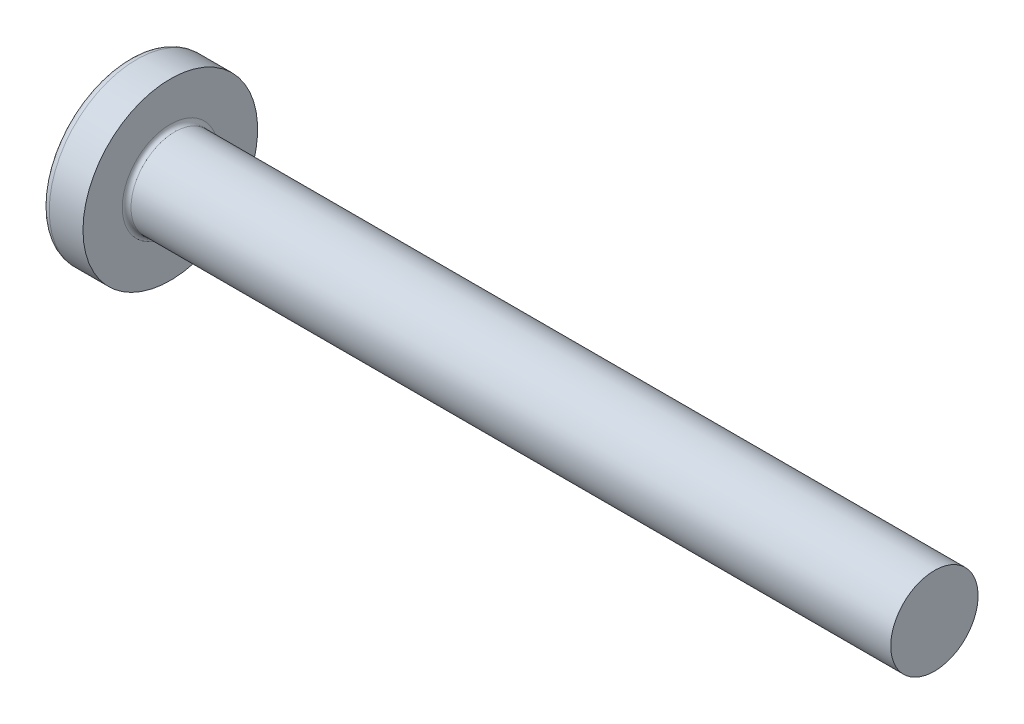
ISO-10303-21;
HEADER;
FILE_DESCRIPTION(('STEP AP214'),'2;1');
FILE_NAME('part.step','',(''),(''),'','','');
FILE_SCHEMA(('AUTOMOTIVE_DESIGN { 1 0 10303 214 1 1 1 1 }'));
ENDSEC;
DATA;
#1=APPLICATION_CONTEXT('core data for automotive mechanical design processes');
#2=APPLICATION_PROTOCOL_DEFINITION('international standard','automotive_design',2000,#1);
#3=PRODUCT_CONTEXT('',#1,'mechanical');
#4=PRODUCT('Part','Part','',(#3));
#5=PRODUCT_RELATED_PRODUCT_CATEGORY('part','',(#4));
#6=PRODUCT_DEFINITION_FORMATION('','',#4);
#7=PRODUCT_DEFINITION_CONTEXT('part definition',#1,'design');
#8=PRODUCT_DEFINITION('design','',#6,#7);
#9=PRODUCT_DEFINITION_SHAPE('','',#8);
#10=(LENGTH_UNIT() NAMED_UNIT(*) SI_UNIT(.MILLI.,.METRE.));
#11=(NAMED_UNIT(*) PLANE_ANGLE_UNIT() SI_UNIT($,.RADIAN.));
#12=(NAMED_UNIT(*) SI_UNIT($,.STERADIAN.) SOLID_ANGLE_UNIT());
#13=UNCERTAINTY_MEASURE_WITH_UNIT(LENGTH_MEASURE(1.E-05),#10,'distance_accuracy_value','');
#14=(GEOMETRIC_REPRESENTATION_CONTEXT(3) GLOBAL_UNCERTAINTY_ASSIGNED_CONTEXT((#13)) GLOBAL_UNIT_ASSIGNED_CONTEXT((#10,
#11,#12)) REPRESENTATION_CONTEXT('',''));
#15=CARTESIAN_POINT('',(0.,0.,0.));
#16=DIRECTION('',(0.,0.,1.));
#17=DIRECTION('',(1.,0.,0.));
#18=AXIS2_PLACEMENT_3D('',#15,#16,#17);
#19=CARTESIAN_POINT('',(0.,-2.15,-0.515));
#20=DIRECTION('',(0.446197753347436,-0.894934391398443,0.));
#21=DIRECTION('',(0.894934391398443,0.446197753347436,0.));
#22=AXIS2_PLACEMENT_3D('',#19,#20,#21);
#23=PLANE('',#22);
#24=DIRECTION('',(0.,0.,1.));
#25=VECTOR('',#24,1.);
#26=CARTESIAN_POINT('',(2.34,-0.983319232260743,-0.515));
#27=LINE('',#26,#25);
#28=CARTESIAN_POINT('',(2.34,-0.983319232260742,-0.515));
#29=VERTEX_POINT('',#28);
#30=CARTESIAN_POINT('',(2.34,-0.983319232260743,0.515));
#31=VERTEX_POINT('',#30);
#32=EDGE_CURVE('E150',#29,#31,#27,.T.);
#33=ORIENTED_EDGE('',*,*,#32,.F.);
#34=DIRECTION('',(0.894934391398443,0.446197753347436,0.));
#35=VECTOR('',#34,1.);
#36=CARTESIAN_POINT('',(0.331830520157853,-1.98455543332603,-0.515));
#37=LINE('',#36,#35);
#38=CARTESIAN_POINT('',(0.331830520157854,-1.98455543332603,-0.515));
#39=VERTEX_POINT('',#38);
#40=EDGE_CURVE('E154',#39,#29,#37,.T.);
#41=ORIENTED_EDGE('',*,*,#40,.F.);
#42=CARTESIAN_POINT('',(0.331830520157854,-1.98455543332603,0.514999999999998));
#43=CARTESIAN_POINT('',(0.319498798424873,-1.99070380194952,0.343333333333332));
#44=CARTESIAN_POINT('',(0.313332937558384,-1.99377798626127,0.171666666666665));
#45=CARTESIAN_POINT('',(0.313332937558389,-1.99377798626128,-0.171666666666671));
#46=CARTESIAN_POINT('',(0.319498798424884,-1.99070380194955,-0.343333333333342));
#47=CARTESIAN_POINT('',(0.331830520157871,-1.98455543332607,-0.515000000000013));
#48=B_SPLINE_CURVE_WITH_KNOTS('',3,(#42,#43,#44,#45,#46,#47),.UNSPECIFIED.,.F.,.F.,(4,2,4),(0.,
0.515414605967532,1.03082921193508),.UNSPECIFIED.);
#49=CARTESIAN_POINT('',(0.331830520157854,-1.98455543332603,0.515));
#50=VERTEX_POINT('',#49);
#51=EDGE_CURVE('E139',#50,#39,#48,.T.);
#52=ORIENTED_EDGE('',*,*,#51,.F.);
#53=DIRECTION('',(-0.894934391398443,-0.446197753347436,0.));
#54=VECTOR('',#53,1.);
#55=CARTESIAN_POINT('',(2.34,-0.983319232260743,0.515));
#56=LINE('',#55,#54);
#57=EDGE_CURVE('E164',#31,#50,#56,.T.);
#58=ORIENTED_EDGE('',*,*,#57,.F.);
#59=EDGE_LOOP('',(#33,#41,#52,#58));
#60=FACE_BOUND('',#59,.T.);
#61=ADVANCED_FACE('F17',(#60),#23,.F.);
#62=CARTESIAN_POINT('',(0.,-2.15,0.514999999999999));
#63=DIRECTION('',(0.,0.,-1.));
#64=DIRECTION('',(-1.,0.,0.));
#65=AXIS2_PLACEMENT_3D('',#62,#63,#64);
#66=PLANE('',#65);
#67=DIRECTION('',(0.,1.,0.));
#68=VECTOR('',#67,1.);
#69=CARTESIAN_POINT('',(2.34,-2.15,0.515));
#70=LINE('',#69,#68);
#71=CARTESIAN_POINT('',(2.34000000000175,-0.677477674907183,0.51499999999998));
#72=VERTEX_POINT('',#71);
#73=EDGE_CURVE('E305',#72,#31,#70,.F.);
#74=ORIENTED_EDGE('',*,*,#73,.T.);
#75=ORIENTED_EDGE('',*,*,#57,.T.);
#76=CARTESIAN_POINT('',(0.331830520157854,-1.98455543332603,0.515000000000001));
#77=CARTESIAN_POINT('',(0.273182530445949,-1.80216454181507,0.515000000000023));
#78=CARTESIAN_POINT('',(0.222773490743651,-1.61790695532938,0.515000000000022));
#79=CARTESIAN_POINT('',(0.138433311358271,-1.24565839240852,0.514999999999977));
#80=CARTESIAN_POINT('',(0.104502171675189,-1.05766741597335,0.514999999999933));
#81=CARTESIAN_POINT('',(0.0788099820017152,-0.867809744563443,0.514999999999866));
#82=B_SPLINE_CURVE_WITH_KNOTS('',3,(#76,#77,#78,#79,#80,#81),.UNSPECIFIED.,.F.,.F.,(4,2,4),(0.,
0.573085827037425,1.14617165407485),.UNSPECIFIED.);
#83=CARTESIAN_POINT('',(0.0788099820150379,-0.867809744561917,0.514999999999933));
#84=VERTEX_POINT('',#83);
#85=EDGE_CURVE('E146',#50,#84,#82,.T.);
#86=ORIENTED_EDGE('',*,*,#85,.T.);
#87=CARTESIAN_POINT('',(0.0788099820105211,-0.867809744561843,0.514999999999999));
#88=CARTESIAN_POINT('',(0.392213734002262,-0.842304642325876,0.514999999999999));
#89=CARTESIAN_POINT('',(0.70559787355606,-0.816547301111019,0.515));
#90=CARTESIAN_POINT('',(1.33229966547313,-0.76425626320608,0.515));
#91=CARTESIAN_POINT('',(1.64561731816469,-0.737722570443666,0.515));
#92=CARTESIAN_POINT('',(2.08593418824368,-0.69969155696372,0.515));
#93=CARTESIAN_POINT('',(2.21297124645575,-0.68863226058366,0.515));
#94=CARTESIAN_POINT('',(2.34000000000109,-0.677477674906791,0.515));
#95=B_SPLINE_CURVE_WITH_KNOTS('',3,(#87,#88,#89,#90,#91,#92,#93,#94),.UNSPECIFIED.,.F.,.F.,(4,2,
2,4),(0.,0.943320959581089,1.88663714759769,2.26918969179948),.UNSPECIFIED.);
#96=EDGE_CURVE('E156',#84,#72,#95,.T.);
#97=ORIENTED_EDGE('',*,*,#96,.T.);
#98=EDGE_LOOP('',(#74,#75,#86,#97));
#99=FACE_BOUND('',#98,.T.);
#100=ADVANCED_FACE('F458',(#99),#66,.T.);
#101=CARTESIAN_POINT('',(0.,2.15,-0.515));
#102=DIRECTION('',(0.,0.,1.));
#103=DIRECTION('',(1.,0.,0.));
#104=AXIS2_PLACEMENT_3D('',#101,#102,#103);
#105=PLANE('',#104);
#106=CARTESIAN_POINT('',(0.0788099820017082,-0.867809744563347,-0.515000000000002));
#107=CARTESIAN_POINT('',(0.104502171675179,-1.05766741597327,-0.515000000000001));
#108=CARTESIAN_POINT('',(0.138433311358259,-1.24565839240845,-0.515));
#109=CARTESIAN_POINT('',(0.222773490743641,-1.61790695532935,-0.515));
#110=CARTESIAN_POINT('',(0.273182530445943,-1.80216454181506,-0.514999999999999));
#111=CARTESIAN_POINT('',(0.331830520157854,-1.98455543332603,-0.514999999999999));
#112=B_SPLINE_CURVE_WITH_KNOTS('',3,(#106,#107,#108,#109,#110,#111),.UNSPECIFIED.,.F.,.F.,(4,2,
4),(0.,0.573085827037473,1.14617165407495),.UNSPECIFIED.);
#113=CARTESIAN_POINT('',(0.0788099820061147,-0.867809744562595,-0.515000000000001));
#114=VERTEX_POINT('',#113);
#115=EDGE_CURVE('E143',#114,#39,#112,.T.);
#116=ORIENTED_EDGE('',*,*,#115,.T.);
#117=ORIENTED_EDGE('',*,*,#40,.T.);
#118=DIRECTION('',(0.,1.,0.));
#119=VECTOR('',#118,1.);
#120=CARTESIAN_POINT('',(2.34,2.15,-0.515));
#121=LINE('',#120,#119);
#122=CARTESIAN_POINT('',(2.34000000000175,-0.677477674907168,-0.515));
#123=VERTEX_POINT('',#122);
#124=EDGE_CURVE('E162',#29,#123,#121,.T.);
#125=ORIENTED_EDGE('',*,*,#124,.T.);
#126=CARTESIAN_POINT('',(2.34000000000109,-0.677477674906791,-0.515));
#127=CARTESIAN_POINT('',(2.07584465982531,-0.700667758110798,-0.515));
#128=CARTESIAN_POINT('',(1.81165398196259,-0.723450497756089,-0.515));
#129=CARTESIAN_POINT('',(1.28321771173505,-0.768360358266413,-0.515));
#130=CARTESIAN_POINT('',(1.01897211955267,-0.79048748127564,-0.515));
#131=CARTESIAN_POINT('',(0.642063816057716,-0.821692201389346,-0.515));
#132=CARTESIAN_POINT('',(0.529417831854457,-0.830972904506625,-0.515));
#133=CARTESIAN_POINT('',(0.304118917866834,-0.849451547308498,-0.515));
#134=CARTESIAN_POINT('',(0.191465988073096,-0.858649486878829,-0.515));
#135=CARTESIAN_POINT('',(0.078809982010521,-0.867809744561842,-0.515));
#136=B_SPLINE_CURVE_WITH_KNOTS('',3,(#126,#127,#128,#129,#130,#131,#132,#133,#134,#135),
.UNSPECIFIED.,.F.,.F.,(4,2,2,2,4),(0.,0.795513032095966,1.59102346217911,1.93010639275618,
2.26918979140427),.UNSPECIFIED.);
#137=EDGE_CURVE('E160',#123,#114,#136,.T.);
#138=ORIENTED_EDGE('',*,*,#137,.T.);
#139=EDGE_LOOP('',(#116,#117,#125,#138));
#140=FACE_BOUND('',#139,.T.);
#141=ADVANCED_FACE('F158',(#140),#105,.T.);
#142=CARTESIAN_POINT('',(0.0788099821420474,0.,0.));
#143=DIRECTION('',(-1.,0.,0.));
#144=DIRECTION('',(0.,0.,1.));
#145=AXIS2_PLACEMENT_3D('',#142,#143,#144);
#146=CONICAL_SURFACE('',#145,1.00911780914714,0.0698131700804186);
#147=CARTESIAN_POINT('',(2.34000000000043,-0.515000000000002,0.677477674906847));
#148=CARTESIAN_POINT('',(2.07584465982464,-0.515000000000003,0.700667758110854));
#149=CARTESIAN_POINT('',(1.81165398196191,-0.515000000000003,0.723450497756147));
#150=CARTESIAN_POINT('',(1.28321771173434,-0.515000000000003,0.768360358266472));
#151=CARTESIAN_POINT('',(1.01897211955194,-0.515000000000002,0.790487481275699));
#152=CARTESIAN_POINT('',(0.642063816056353,-0.515000000000003,0.821692201389457));
#153=CARTESIAN_POINT('',(0.529417831852476,-0.515000000000003,0.830972904506786));
#154=CARTESIAN_POINT('',(0.304118917863614,-0.515000000000003,0.84945154730876));
#155=CARTESIAN_POINT('',(0.191465988069257,-0.515000000000003,0.85864948687914));
#156=CARTESIAN_POINT('',(0.0788099820060616,-0.515000000000003,0.867809744562203));
#157=B_SPLINE_CURVE_WITH_KNOTS('',3,(#147,#148,#149,#150,#151,#152,#153,#154,#155,#156),
.UNSPECIFIED.,.F.,.F.,(4,2,2,2,4),(0.,0.795513032096009,1.5910234621792,1.93010639275813,
2.26918979140808),.UNSPECIFIED.);
#158=CARTESIAN_POINT('',(2.34000000000175,-0.515000000000003,0.677477674907166));
#159=VERTEX_POINT('',#158);
#160=CARTESIAN_POINT('',(0.0788099820150116,-0.515000000000002,0.867809744611743));
#161=VERTEX_POINT('',#160);
#162=EDGE_CURVE('E289',#159,#161,#157,.T.);
#163=ORIENTED_EDGE('',*,*,#162,.F.);
#164=CARTESIAN_POINT('',(2.34000000000378,0.,0.));
#165=DIRECTION('',(-1.,0.,0.));
#166=DIRECTION('',(0.,0.,1.));
#167=AXIS2_PLACEMENT_3D('',#164,#165,#166);
#168=CIRCLE('',#167,0.850999999997271);
#169=EDGE_CURVE('E296',#72,#159,#168,.T.);
#170=ORIENTED_EDGE('',*,*,#169,.F.);
#171=ORIENTED_EDGE('',*,*,#96,.F.);
#172=CARTESIAN_POINT('',(0.0788099820283605,0.,0.));
#173=DIRECTION('',(-1.,0.,0.));
#174=DIRECTION('',(0.,0.,1.));
#175=AXIS2_PLACEMENT_3D('',#172,#173,#174);
#176=CIRCLE('',#175,1.00911780915509);
#177=EDGE_CURVE('E298',#161,#84,#176,.F.);
#178=ORIENTED_EDGE('',*,*,#177,.F.);
#179=EDGE_LOOP('',(#163,#170,#171,#178));
#180=FACE_BOUND('',#179,.T.);
#181=ADVANCED_FACE('F447',(#180),#146,.F.);
#182=CARTESIAN_POINT('',(0.0788099821420474,0.,0.));
#183=DIRECTION('',(-1.,0.,0.));
#184=DIRECTION('',(0.,0.,1.));
#185=AXIS2_PLACEMENT_3D('',#182,#183,#184);
#186=CONICAL_SURFACE('',#185,1.00911780914714,0.0698131700804186);
#187=CARTESIAN_POINT('',(0.0788099820060611,-0.514999999999996,-0.867809744562207));
#188=CARTESIAN_POINT('',(0.392213733997899,-0.514999999999996,-0.842304642326235));
#189=CARTESIAN_POINT('',(0.705597873551794,-0.514999999999997,-0.816547301111373));
#190=CARTESIAN_POINT('',(1.33229966546905,-0.514999999999997,-0.764256263206425));
#191=CARTESIAN_POINT('',(1.64561731816071,-0.514999999999997,-0.737722570444007));
#192=CARTESIAN_POINT('',(2.08593418824088,-0.514999999999997,-0.699691556963965));
#193=CARTESIAN_POINT('',(2.21297124645402,-0.514999999999997,-0.688632260583813));
#194=CARTESIAN_POINT('',(2.34000000000043,-0.514999999999998,-0.677477674906851));
#195=B_SPLINE_CURVE_WITH_KNOTS('',3,(#187,#188,#189,#190,#191,#192,#193,#194),.UNSPECIFIED.,.F.,
.F.,(4,2,2,4),(0.,0.94332095958138,1.88663714759827,2.2691896918033),.UNSPECIFIED.);
#196=CARTESIAN_POINT('',(0.0788099820172106,-0.514999999999994,-0.867809744611342));
#197=VERTEX_POINT('',#196);
#198=CARTESIAN_POINT('',(2.34000000000175,-0.514999999999998,-0.67747767490717));
#199=VERTEX_POINT('',#198);
#200=EDGE_CURVE('E283',#197,#199,#195,.T.);
#201=ORIENTED_EDGE('',*,*,#200,.F.);
#202=CARTESIAN_POINT('',(0.0788099820283605,0.,0.));
#203=DIRECTION('',(-1.,0.,0.));
#204=DIRECTION('',(0.,0.,1.));
#205=AXIS2_PLACEMENT_3D('',#202,#203,#204);
#206=CIRCLE('',#205,1.00911780915509);
#207=EDGE_CURVE('E295',#114,#197,#206,.F.);
#208=ORIENTED_EDGE('',*,*,#207,.F.);
#209=ORIENTED_EDGE('',*,*,#137,.F.);
#210=CARTESIAN_POINT('',(2.34000000000378,0.,0.));
#211=DIRECTION('',(-1.,0.,0.));
#212=DIRECTION('',(0.,0.,1.));
#213=AXIS2_PLACEMENT_3D('',#210,#211,#212);
#214=CIRCLE('',#213,0.850999999997271);
#215=EDGE_CURVE('E290',#199,#123,#214,.T.);
#216=ORIENTED_EDGE('',*,*,#215,.F.);
#217=EDGE_LOOP('',(#201,#208,#209,#216));
#218=FACE_BOUND('',#217,.T.);
#219=ADVANCED_FACE('F435',(#218),#186,.F.);
#220=CARTESIAN_POINT('',(0.,-0.514999999999992,-2.15));
#221=DIRECTION('',(0.,1.,0.));
#222=DIRECTION('',(0.,0.,1.));
#223=AXIS2_PLACEMENT_3D('',#220,#221,#222);
#224=PLANE('',#223);
#225=CARTESIAN_POINT('',(6.5,-0.515000000000002,0.));
#226=DIRECTION('',(0.,1.,0.));
#227=DIRECTION('',(0.,0.,1.));
#228=AXIS2_PLACEMENT_3D('',#225,#226,#227);
#229=CIRCLE('',#228,6.47956595768575);
#230=CARTESIAN_POINT('',(0.331830520157854,-0.515000000000004,1.98455543332603));
#231=VERTEX_POINT('',#230);
#232=EDGE_CURVE('E445',#161,#231,#229,.T.);
#233=ORIENTED_EDGE('',*,*,#232,.T.);
#234=DIRECTION('',(0.894934391398443,0.,-0.446197753347436));
#235=VECTOR('',#234,1.);
#236=CARTESIAN_POINT('',(2.34,-0.515000000000007,0.983319232260741));
#237=LINE('',#236,#235);
#238=CARTESIAN_POINT('',(2.34,-0.515000000000006,0.983319232260741));
#239=VERTEX_POINT('',#238);
#240=EDGE_CURVE('E271',#231,#239,#237,.T.);
#241=ORIENTED_EDGE('',*,*,#240,.T.);
#242=DIRECTION('',(0.,0.,1.));
#243=VECTOR('',#242,1.);
#244=CARTESIAN_POINT('',(2.34,-0.514999999999992,-2.15));
#245=LINE('',#244,#243);
#246=EDGE_CURVE('E286',#239,#159,#245,.F.);
#247=ORIENTED_EDGE('',*,*,#246,.T.);
#248=ORIENTED_EDGE('',*,*,#162,.T.);
#249=EDGE_LOOP('',(#233,#241,#247,#248));
#250=FACE_BOUND('',#249,.T.);
#251=ADVANCED_FACE('F431',(#250),#224,.T.);
#252=CARTESIAN_POINT('',(0.,-0.514999999999992,-2.15));
#253=DIRECTION('',(0.,1.,0.));
#254=DIRECTION('',(0.,0.,1.));
#255=AXIS2_PLACEMENT_3D('',#252,#253,#254);
#256=PLANE('',#255);
#257=DIRECTION('',(0.,0.,1.));
#258=VECTOR('',#257,1.);
#259=CARTESIAN_POINT('',(2.34,-0.514999999999992,-2.15));
#260=LINE('',#259,#258);
#261=CARTESIAN_POINT('',(2.34,-0.514999999999996,-0.983319232260743));
#262=VERTEX_POINT('',#261);
#263=EDGE_CURVE('E281',#199,#262,#260,.F.);
#264=ORIENTED_EDGE('',*,*,#263,.T.);
#265=DIRECTION('',(-0.894934391398443,0.,-0.446197753347436));
#266=VECTOR('',#265,1.);
#267=CARTESIAN_POINT('',(0.,-0.514999999999996,-2.15));
#268=LINE('',#267,#266);
#269=CARTESIAN_POINT('',(0.331830520157854,-0.514999999999992,-1.98455543332603));
#270=VERTEX_POINT('',#269);
#271=EDGE_CURVE('E261',#262,#270,#268,.T.);
#272=ORIENTED_EDGE('',*,*,#271,.T.);
#273=CARTESIAN_POINT('',(6.5,-0.514999999999992,0.));
#274=DIRECTION('',(0.,1.,0.));
#275=DIRECTION('',(0.,0.,1.));
#276=AXIS2_PLACEMENT_3D('',#273,#274,#275);
#277=CIRCLE('',#276,6.47956595768575);
#278=EDGE_CURVE('E708',#270,#197,#277,.T.);
#279=ORIENTED_EDGE('',*,*,#278,.T.);
#280=ORIENTED_EDGE('',*,*,#200,.T.);
#281=EDGE_LOOP('',(#264,#272,#279,#280));
#282=FACE_BOUND('',#281,.T.);
#283=ADVANCED_FACE('F426',(#282),#256,.T.);
#284=CARTESIAN_POINT('',(2.34,-0.515000000000004,0.983319232260741));
#285=DIRECTION('',(0.446197753347436,0.,0.894934391398443));
#286=DIRECTION('',(0.894934391398443,0.,-0.446197753347436));
#287=AXIS2_PLACEMENT_3D('',#284,#285,#286);
#288=PLANE('',#287);
#289=DIRECTION('',(0.,1.,0.));
#290=VECTOR('',#289,1.);
#291=CARTESIAN_POINT('',(2.34,-0.515000000000004,0.983319232260741));
#292=LINE('',#291,#290);
#293=CARTESIAN_POINT('',(2.34,0.514999999999997,0.983319232260743));
#294=VERTEX_POINT('',#293);
#295=EDGE_CURVE('E274',#239,#294,#292,.T.);
#296=ORIENTED_EDGE('',*,*,#295,.F.);
#297=ORIENTED_EDGE('',*,*,#240,.F.);
#298=CARTESIAN_POINT('',(0.331830520157854,0.514999999999994,1.98455543332603));
#299=CARTESIAN_POINT('',(0.319498798424876,0.343333333333328,1.99070380194953));
#300=CARTESIAN_POINT('',(0.313332937558386,0.171666666666661,1.99377798626128));
#301=CARTESIAN_POINT('',(0.313332937558386,-0.171666666666673,1.99377798626127));
#302=CARTESIAN_POINT('',(0.319498798424876,-0.34333333333334,1.99070380194953));
#303=CARTESIAN_POINT('',(0.331830520157854,-0.515000000000006,1.98455543332603));
#304=B_SPLINE_CURVE_WITH_KNOTS('',3,(#298,#299,#300,#301,#302,#303),.UNSPECIFIED.,.F.,.F.,(4,2,
4),(0.,0.515414605967534,1.03082921193507),.UNSPECIFIED.);
#305=CARTESIAN_POINT('',(0.331830520157854,0.514999999999988,1.98455543332604));
#306=VERTEX_POINT('',#305);
#307=EDGE_CURVE('E275',#306,#231,#304,.T.);
#308=ORIENTED_EDGE('',*,*,#307,.F.);
#309=DIRECTION('',(-0.894934391398443,0.,0.446197753347436));
#310=VECTOR('',#309,1.);
#311=CARTESIAN_POINT('',(2.34,0.514999999999997,0.983319232260744));
#312=LINE('',#311,#310);
#313=EDGE_CURVE('E255',#294,#306,#312,.T.);
#314=ORIENTED_EDGE('',*,*,#313,.F.);
#315=EDGE_LOOP('',(#296,#297,#308,#314));
#316=FACE_BOUND('',#315,.T.);
#317=ADVANCED_FACE('F423',(#316),#288,.F.);
#318=CARTESIAN_POINT('',(2.34,0.983319232260742,-0.515));
#319=DIRECTION('',(-1.,0.,0.));
#320=DIRECTION('',(0.,0.,1.));
#321=AXIS2_PLACEMENT_3D('',#318,#319,#320);
#322=PLANE('',#321);
#323=ORIENTED_EDGE('',*,*,#124,.F.);
#324=ORIENTED_EDGE('',*,*,#32,.T.);
#325=ORIENTED_EDGE('',*,*,#73,.F.);
#326=CARTESIAN_POINT('',(2.33999999999972,0.,0.));
#327=DIRECTION('',(-1.,0.,0.));
#328=DIRECTION('',(0.,0.,1.));
#329=AXIS2_PLACEMENT_3D('',#326,#327,#328);
#330=CIRCLE('',#329,0.850999999999935);
#331=EDGE_CURVE('E246',#72,#123,#330,.F.);
#332=ORIENTED_EDGE('',*,*,#331,.T.);
#333=EDGE_LOOP('',(#323,#324,#325,#332));
#334=FACE_BOUND('',#333,.T.);
#335=ADVANCED_FACE('F403',(#334),#322,.T.);
#336=CARTESIAN_POINT('',(0.,0.515000000000008,-2.15));
#337=DIRECTION('',(0.446197753347436,0.,-0.894934391398443));
#338=DIRECTION('',(-0.894934391398443,0.,-0.446197753347436));
#339=AXIS2_PLACEMENT_3D('',#336,#337,#338);
#340=PLANE('',#339);
#341=DIRECTION('',(0.,1.,0.));
#342=VECTOR('',#341,1.);
#343=CARTESIAN_POINT('',(2.34,0.983319232260742,-0.983319232260741));
#344=LINE('',#343,#342);
#345=CARTESIAN_POINT('',(2.34,0.515000000000003,-0.98331923226074));
#346=VERTEX_POINT('',#345);
#347=EDGE_CURVE('E252',#346,#262,#344,.F.);
#348=ORIENTED_EDGE('',*,*,#347,.F.);
#349=DIRECTION('',(0.894934391398443,0.,0.446197753347436));
#350=VECTOR('',#349,1.);
#351=CARTESIAN_POINT('',(0.331830520157856,0.515000000000007,-1.98455543332603));
#352=LINE('',#351,#350);
#353=CARTESIAN_POINT('',(0.331830520157855,0.51500000000001,-1.98455543332603));
#354=VERTEX_POINT('',#353);
#355=EDGE_CURVE('E236',#354,#346,#352,.T.);
#356=ORIENTED_EDGE('',*,*,#355,.F.);
#357=CARTESIAN_POINT('',(0.331830520157855,-0.514999999999994,-1.98455543332604));
#358=CARTESIAN_POINT('',(0.319498798424876,-0.343333333333327,-1.99070380194953));
#359=CARTESIAN_POINT('',(0.313332937558386,-0.17166666666666,-1.99377798626128));
#360=CARTESIAN_POINT('',(0.313332937558387,0.171666666666674,-1.99377798626127));
#361=CARTESIAN_POINT('',(0.319498798424876,0.343333333333341,-1.99070380194953));
#362=CARTESIAN_POINT('',(0.331830520157856,0.515000000000007,-1.98455543332603));
#363=B_SPLINE_CURVE_WITH_KNOTS('',3,(#357,#358,#359,#360,#361,#362),.UNSPECIFIED.,.F.,.F.,(4,2,
4),(0.,0.515414605967534,1.03082921193507),.UNSPECIFIED.);
#364=EDGE_CURVE('E264',#270,#354,#363,.T.);
#365=ORIENTED_EDGE('',*,*,#364,.F.);
#366=ORIENTED_EDGE('',*,*,#271,.F.);
#367=EDGE_LOOP('',(#348,#356,#365,#366));
#368=FACE_BOUND('',#367,.T.);
#369=ADVANCED_FACE('F398',(#368),#340,.F.);
#370=CARTESIAN_POINT('',(0.,0.514999999999993,2.15));
#371=DIRECTION('',(0.,-1.,0.));
#372=DIRECTION('',(0.,0.,-1.));
#373=AXIS2_PLACEMENT_3D('',#370,#371,#372);
#374=PLANE('',#373);
#375=DIRECTION('',(0.,0.,1.));
#376=VECTOR('',#375,1.);
#377=CARTESIAN_POINT('',(2.34,0.514999999999997,-0.515));
#378=LINE('',#377,#376);
#379=CARTESIAN_POINT('',(2.34000000000009,0.514999999999978,0.677477674907863));
#380=VERTEX_POINT('',#379);
#381=EDGE_CURVE('E249',#294,#380,#378,.F.);
#382=ORIENTED_EDGE('',*,*,#381,.F.);
#383=ORIENTED_EDGE('',*,*,#313,.T.);
#384=CARTESIAN_POINT('',(6.5,0.514999999999993,0.));
#385=DIRECTION('',(0.,1.,0.));
#386=DIRECTION('',(0.,0.,1.));
#387=AXIS2_PLACEMENT_3D('',#384,#385,#386);
#388=CIRCLE('',#387,6.47956595768575);
#389=CARTESIAN_POINT('',(0.0788099820150342,0.514999999999993,0.867809744611911));
#390=VERTEX_POINT('',#389);
#391=EDGE_CURVE('E258',#306,#390,#388,.F.);
#392=ORIENTED_EDGE('',*,*,#391,.T.);
#393=CARTESIAN_POINT('',(0.0788099820105218,0.514999999999997,0.867809744561844));
#394=CARTESIAN_POINT('',(0.392213734002263,0.514999999999997,0.842304642325877));
#395=CARTESIAN_POINT('',(0.705597873556061,0.514999999999997,0.81654730111102));
#396=CARTESIAN_POINT('',(1.33229966547313,0.514999999999997,0.764256263206081));
#397=CARTESIAN_POINT('',(1.64561731816469,0.514999999999998,0.737722570443667));
#398=CARTESIAN_POINT('',(2.08593418824345,0.514999999999998,0.699691556963741));
#399=CARTESIAN_POINT('',(2.21297124645529,0.514999999999998,0.688632260583701));
#400=CARTESIAN_POINT('',(2.3400000000004,0.514999999999998,0.677477674906854));
#401=B_SPLINE_CURVE_WITH_KNOTS('',3,(#393,#394,#395,#396,#397,#398,#399,#400),.UNSPECIFIED.,.F.,
.F.,(4,2,2,4),(0.,0.943320959581089,1.88663714759769,2.26918969179879),.UNSPECIFIED.);
#402=EDGE_CURVE('E383',#390,#380,#401,.T.);
#403=ORIENTED_EDGE('',*,*,#402,.T.);
#404=EDGE_LOOP('',(#382,#383,#392,#403));
#405=FACE_BOUND('',#404,.T.);
#406=ADVANCED_FACE('F392',(#405),#374,.T.);
#407=CARTESIAN_POINT('',(2.34,0.983319232260742,-0.515));
#408=DIRECTION('',(-1.,0.,0.));
#409=DIRECTION('',(0.,0.,1.));
#410=AXIS2_PLACEMENT_3D('',#407,#408,#409);
#411=PLANE('',#410);
#412=DIRECTION('',(0.,0.,-1.));
#413=VECTOR('',#412,1.);
#414=CARTESIAN_POINT('',(2.34,0.514999999999993,2.15));
#415=LINE('',#414,#413);
#416=CARTESIAN_POINT('',(2.34000000000175,0.514999999999983,-0.677477674907181));
#417=VERTEX_POINT('',#416);
#418=EDGE_CURVE('E243',#346,#417,#415,.F.);
#419=ORIENTED_EDGE('',*,*,#418,.F.);
#420=ORIENTED_EDGE('',*,*,#347,.T.);
#421=ORIENTED_EDGE('',*,*,#263,.F.);
#422=CARTESIAN_POINT('',(2.33999999999972,0.,0.));
#423=DIRECTION('',(-1.,0.,0.));
#424=DIRECTION('',(0.,0.,1.));
#425=AXIS2_PLACEMENT_3D('',#422,#423,#424);
#426=CIRCLE('',#425,0.850999999999935);
#427=EDGE_CURVE('E235',#199,#417,#426,.F.);
#428=ORIENTED_EDGE('',*,*,#427,.T.);
#429=EDGE_LOOP('',(#419,#420,#421,#428));
#430=FACE_BOUND('',#429,.T.);
#431=ADVANCED_FACE('F397',(#430),#411,.T.);
#432=CARTESIAN_POINT('',(2.34,0.983319232260742,-0.515));
#433=DIRECTION('',(-1.,0.,0.));
#434=DIRECTION('',(0.,0.,1.));
#435=AXIS2_PLACEMENT_3D('',#432,#433,#434);
#436=PLANE('',#435);
#437=ORIENTED_EDGE('',*,*,#246,.F.);
#438=ORIENTED_EDGE('',*,*,#295,.T.);
#439=ORIENTED_EDGE('',*,*,#381,.T.);
#440=CARTESIAN_POINT('',(2.33999999999972,0.,0.));
#441=DIRECTION('',(-1.,0.,0.));
#442=DIRECTION('',(0.,0.,1.));
#443=AXIS2_PLACEMENT_3D('',#440,#441,#442);
#444=CIRCLE('',#443,0.850999999999935);
#445=EDGE_CURVE('E231',#380,#159,#444,.F.);
#446=ORIENTED_EDGE('',*,*,#445,.T.);
#447=EDGE_LOOP('',(#437,#438,#439,#446));
#448=FACE_BOUND('',#447,.T.);
#449=ADVANCED_FACE('F615',(#448),#436,.T.);
#450=CARTESIAN_POINT('',(0.,0.514999999999993,2.15));
#451=DIRECTION('',(0.,-1.,0.));
#452=DIRECTION('',(0.,0.,-1.));
#453=AXIS2_PLACEMENT_3D('',#450,#451,#452);
#454=PLANE('',#453);
#455=CARTESIAN_POINT('',(6.5,0.515000000000003,0.));
#456=DIRECTION('',(0.,1.,0.));
#457=DIRECTION('',(0.,0.,1.));
#458=AXIS2_PLACEMENT_3D('',#455,#456,#457);
#459=CIRCLE('',#458,6.47956595768574);
#460=CARTESIAN_POINT('',(0.0788099820150344,0.515000000000003,-0.867809744611907));
#461=VERTEX_POINT('',#460);
#462=EDGE_CURVE('E240',#461,#354,#459,.F.);
#463=ORIENTED_EDGE('',*,*,#462,.T.);
#464=ORIENTED_EDGE('',*,*,#355,.T.);
#465=ORIENTED_EDGE('',*,*,#418,.T.);
#466=CARTESIAN_POINT('',(2.34000000000109,0.515000000000003,-0.677477674906789));
#467=CARTESIAN_POINT('',(2.07584465982531,0.515000000000003,-0.700667758110796));
#468=CARTESIAN_POINT('',(1.81165398196259,0.515000000000003,-0.723450497756088));
#469=CARTESIAN_POINT('',(1.28321771173505,0.515000000000003,-0.768360358266412));
#470=CARTESIAN_POINT('',(1.01897211955267,0.515000000000003,-0.790487481275638));
#471=CARTESIAN_POINT('',(0.642063816057716,0.515000000000003,-0.821692201389344));
#472=CARTESIAN_POINT('',(0.529417831854458,0.515000000000003,-0.830972904506623));
#473=CARTESIAN_POINT('',(0.304118917866835,0.515000000000003,-0.849451547308497));
#474=CARTESIAN_POINT('',(0.191465988073097,0.515000000000003,-0.858649486878827));
#475=CARTESIAN_POINT('',(0.0788099820105217,0.515000000000003,-0.86780974456184));
#476=B_SPLINE_CURVE_WITH_KNOTS('',3,(#466,#467,#468,#469,#470,#471,#472,#473,#474,#475),
.UNSPECIFIED.,.F.,.F.,(4,2,2,2,4),(0.,0.795513032095966,1.59102346217911,1.93010639275618,
2.26918979140427),.UNSPECIFIED.);
#477=EDGE_CURVE('E230',#417,#461,#476,.T.);
#478=ORIENTED_EDGE('',*,*,#477,.T.);
#479=EDGE_LOOP('',(#463,#464,#465,#478));
#480=FACE_BOUND('',#479,.T.);
#481=ADVANCED_FACE('F377',(#480),#454,.T.);
#482=CARTESIAN_POINT('',(0.0788099821420474,0.,0.));
#483=DIRECTION('',(-1.,0.,0.));
#484=DIRECTION('',(0.,0.,1.));
#485=AXIS2_PLACEMENT_3D('',#482,#483,#484);
#486=CONICAL_SURFACE('',#485,1.00911780914714,0.0698131700804186);
#487=ORIENTED_EDGE('',*,*,#402,.F.);
#488=CARTESIAN_POINT('',(0.0788099820283605,0.,0.));
#489=DIRECTION('',(-1.,0.,0.));
#490=DIRECTION('',(0.,0.,1.));
#491=AXIS2_PLACEMENT_3D('',#488,#489,#490);
#492=CIRCLE('',#491,1.00911780915509);
#493=CARTESIAN_POINT('',(0.0788099820150127,0.867809744561701,0.515));
#494=VERTEX_POINT('',#493);
#495=EDGE_CURVE('E239',#494,#390,#492,.F.);
#496=ORIENTED_EDGE('',*,*,#495,.F.);
#497=CARTESIAN_POINT('',(2.33999999999974,0.67747767490691,0.515));
#498=CARTESIAN_POINT('',(2.07584465982393,0.700667758110917,0.515));
#499=CARTESIAN_POINT('',(1.81165398196119,0.72345049775621,0.515));
#500=CARTESIAN_POINT('',(1.28321771173358,0.768360358266537,0.515));
#501=CARTESIAN_POINT('',(1.01897211955117,0.790487481275765,0.515));
#502=CARTESIAN_POINT('',(0.642063816055702,0.821692201389512,0.515));
#503=CARTESIAN_POINT('',(0.529417831851954,0.830972904506831,0.515));
#504=CARTESIAN_POINT('',(0.304118917863353,0.849451547308783,0.515));
#505=CARTESIAN_POINT('',(0.191465988069127,0.858649486879153,0.515));
#506=CARTESIAN_POINT('',(0.078809982006062,0.867809744562205,0.515));
#507=B_SPLINE_CURVE_WITH_KNOTS('',3,(#497,#498,#499,#500,#501,#502,#503,#504,#505,#506),
.UNSPECIFIED.,.F.,.F.,(4,2,2,2,4),(0.,0.795513032096054,1.59102346217929,1.93010639275782,
2.26918979140739),.UNSPECIFIED.);
#508=CARTESIAN_POINT('',(2.33999999999976,0.67747767490789,0.51499999999998));
#509=VERTEX_POINT('',#508);
#510=EDGE_CURVE('E363',#509,#494,#507,.T.);
#511=ORIENTED_EDGE('',*,*,#510,.F.);
#512=CARTESIAN_POINT('',(2.33999999999979,0.,0.));
#513=DIRECTION('',(-1.,0.,0.));
#514=DIRECTION('',(0.,0.,1.));
#515=AXIS2_PLACEMENT_3D('',#512,#513,#514);
#516=CIRCLE('',#515,0.850999999999935);
#517=EDGE_CURVE('E232',#509,#380,#516,.F.);
#518=ORIENTED_EDGE('',*,*,#517,.T.);
#519=EDGE_LOOP('',(#487,#496,#511,#518));
#520=FACE_BOUND('',#519,.T.);
#521=ADVANCED_FACE('F372',(#520),#486,.F.);
#522=CARTESIAN_POINT('',(2.34000000000001,0.,0.));
#523=DIRECTION('',(-1.,0.,0.));
#524=DIRECTION('',(0.,0.,1.));
#525=AXIS2_PLACEMENT_3D('',#522,#523,#524);
#526=CONICAL_SURFACE('',#525,0.850999999999047,1.25663706143483);
#527=CARTESIAN_POINT('',(2.61650666149399,0.,0.));
#528=VERTEX_POINT('',#527);
#529=VERTEX_LOOP('',#528);
#530=FACE_BOUND('',#529,.T.);
#531=ORIENTED_EDGE('',*,*,#169,.T.);
#532=ORIENTED_EDGE('',*,*,#445,.F.);
#533=ORIENTED_EDGE('',*,*,#517,.F.);
#534=CARTESIAN_POINT('',(2.33999999999972,0.,0.));
#535=DIRECTION('',(-1.,0.,0.));
#536=DIRECTION('',(0.,0.,1.));
#537=AXIS2_PLACEMENT_3D('',#534,#535,#536);
#538=CIRCLE('',#537,0.850999999999935);
#539=CARTESIAN_POINT('',(2.34000000000175,0.677477674907183,-0.51499999999998));
#540=VERTEX_POINT('',#539);
#541=EDGE_CURVE('E224',#540,#509,#538,.F.);
#542=ORIENTED_EDGE('',*,*,#541,.F.);
#543=CARTESIAN_POINT('',(2.34000000000378,0.,0.));
#544=DIRECTION('',(-1.,0.,0.));
#545=DIRECTION('',(0.,0.,1.));
#546=AXIS2_PLACEMENT_3D('',#543,#544,#545);
#547=CIRCLE('',#546,0.850999999997271);
#548=EDGE_CURVE('E227',#540,#417,#547,.T.);
#549=ORIENTED_EDGE('',*,*,#548,.T.);
#550=ORIENTED_EDGE('',*,*,#427,.F.);
#551=ORIENTED_EDGE('',*,*,#215,.T.);
#552=ORIENTED_EDGE('',*,*,#331,.F.);
#553=EDGE_LOOP('',(#531,#532,#533,#542,#549,#550,#551,#552));
#554=FACE_BOUND('',#553,.T.);
#555=ADVANCED_FACE('F376',(#530,#554),#526,.F.);
#556=CARTESIAN_POINT('',(0.0788099821420474,0.,0.));
#557=DIRECTION('',(-1.,0.,0.));
#558=DIRECTION('',(0.,0.,1.));
#559=AXIS2_PLACEMENT_3D('',#556,#557,#558);
#560=CONICAL_SURFACE('',#559,1.00911780914714,0.0698131700804186);
#561=ORIENTED_EDGE('',*,*,#477,.F.);
#562=ORIENTED_EDGE('',*,*,#548,.F.);
#563=CARTESIAN_POINT('',(0.078809982006062,0.867809744562205,-0.515));
#564=CARTESIAN_POINT('',(0.3922137339979,0.842304642326233,-0.515));
#565=CARTESIAN_POINT('',(0.705597873551795,0.816547301111371,-0.515));
#566=CARTESIAN_POINT('',(1.33229966546906,0.764256263206423,-0.515));
#567=CARTESIAN_POINT('',(1.64561731816071,0.737722570444005,-0.515));
#568=CARTESIAN_POINT('',(2.08593418824088,0.699691556963963,-0.515));
#569=CARTESIAN_POINT('',(2.21297124645402,0.688632260583811,-0.515));
#570=CARTESIAN_POINT('',(2.34000000000043,0.677477674906849,-0.515));
#571=B_SPLINE_CURVE_WITH_KNOTS('',3,(#563,#564,#565,#566,#567,#568,#569,#570),.UNSPECIFIED.,.F.,
.F.,(4,2,2,4),(0.,0.94332095958138,1.88663714759827,2.2691896918033),.UNSPECIFIED.);
#572=CARTESIAN_POINT('',(0.0788099820172113,0.867809744561298,-0.515));
#573=VERTEX_POINT('',#572);
#574=EDGE_CURVE('E214',#573,#540,#571,.T.);
#575=ORIENTED_EDGE('',*,*,#574,.F.);
#576=CARTESIAN_POINT('',(0.0788099820283605,0.,0.));
#577=DIRECTION('',(-1.,0.,0.));
#578=DIRECTION('',(0.,0.,1.));
#579=AXIS2_PLACEMENT_3D('',#576,#577,#578);
#580=CIRCLE('',#579,1.00911780915509);
#581=EDGE_CURVE('E370',#461,#573,#580,.F.);
#582=ORIENTED_EDGE('',*,*,#581,.F.);
#583=EDGE_LOOP('',(#561,#562,#575,#582));
#584=FACE_BOUND('',#583,.T.);
#585=ADVANCED_FACE('F339',(#584),#560,.F.);
#586=CARTESIAN_POINT('',(0.,-2.15,0.514999999999999));
#587=DIRECTION('',(0.,0.,-1.));
#588=DIRECTION('',(-1.,0.,0.));
#589=AXIS2_PLACEMENT_3D('',#586,#587,#588);
#590=PLANE('',#589);
#591=CARTESIAN_POINT('',(0.0788099820016649,0.86780974456301,0.515));
#592=CARTESIAN_POINT('',(0.104502171675132,1.05766741597299,0.515));
#593=CARTESIAN_POINT('',(0.138433311358215,1.24565839240823,0.515));
#594=CARTESIAN_POINT('',(0.222773490743613,1.61790695532924,0.515));
#595=CARTESIAN_POINT('',(0.273182530445927,1.80216454181501,0.515));
#596=CARTESIAN_POINT('',(0.331830520157858,1.98455543332603,0.515000000000001));
#597=B_SPLINE_CURVE_WITH_KNOTS('',3,(#591,#592,#593,#594,#595,#596),.UNSPECIFIED.,.F.,.F.,(4,2,
4),(0.,0.573085827037642,1.14617165407528),.UNSPECIFIED.);
#598=CARTESIAN_POINT('',(0.331830520157858,1.98455543332603,0.514999999999999));
#599=VERTEX_POINT('',#598);
#600=EDGE_CURVE('E358',#494,#599,#597,.T.);
#601=ORIENTED_EDGE('',*,*,#600,.T.);
#602=DIRECTION('',(-0.894934391398443,0.446197753347436,0.));
#603=VECTOR('',#602,1.);
#604=CARTESIAN_POINT('',(2.34,0.983319232260742,0.515));
#605=LINE('',#604,#603);
#606=CARTESIAN_POINT('',(2.34,0.983319232260743,0.515));
#607=VERTEX_POINT('',#606);
#608=EDGE_CURVE('E207',#599,#607,#605,.F.);
#609=ORIENTED_EDGE('',*,*,#608,.T.);
#610=DIRECTION('',(0.,1.,0.));
#611=VECTOR('',#610,1.);
#612=CARTESIAN_POINT('',(2.34,0.983319232260742,0.515));
#613=LINE('',#612,#611);
#614=EDGE_CURVE('E220',#509,#607,#613,.T.);
#615=ORIENTED_EDGE('',*,*,#614,.F.);
#616=ORIENTED_EDGE('',*,*,#510,.T.);
#617=EDGE_LOOP('',(#601,#609,#615,#616));
#618=FACE_BOUND('',#617,.T.);
#619=ADVANCED_FACE('F351',(#618),#590,.T.);
#620=CARTESIAN_POINT('',(2.34,0.983319232260742,-0.515));
#621=DIRECTION('',(-1.,0.,0.));
#622=DIRECTION('',(0.,0.,1.));
#623=AXIS2_PLACEMENT_3D('',#620,#621,#622);
#624=PLANE('',#623);
#625=ORIENTED_EDGE('',*,*,#614,.T.);
#626=DIRECTION('',(0.,0.,1.));
#627=VECTOR('',#626,1.);
#628=CARTESIAN_POINT('',(2.34,0.983319232260742,0.515));
#629=LINE('',#628,#627);
#630=CARTESIAN_POINT('',(2.34,0.983319232260743,-0.515));
#631=VERTEX_POINT('',#630);
#632=EDGE_CURVE('E204',#607,#631,#629,.F.);
#633=ORIENTED_EDGE('',*,*,#632,.T.);
#634=DIRECTION('',(0.,1.,0.));
#635=VECTOR('',#634,1.);
#636=CARTESIAN_POINT('',(2.34,2.15,-0.515));
#637=LINE('',#636,#635);
#638=EDGE_CURVE('E209',#540,#631,#637,.T.);
#639=ORIENTED_EDGE('',*,*,#638,.F.);
#640=ORIENTED_EDGE('',*,*,#541,.T.);
#641=EDGE_LOOP('',(#625,#633,#639,#640));
#642=FACE_BOUND('',#641,.T.);
#643=ADVANCED_FACE('F347',(#642),#624,.T.);
#644=CARTESIAN_POINT('',(0.,2.15,-0.515));
#645=DIRECTION('',(0.,0.,1.));
#646=DIRECTION('',(1.,0.,0.));
#647=AXIS2_PLACEMENT_3D('',#644,#645,#646);
#648=PLANE('',#647);
#649=ORIENTED_EDGE('',*,*,#638,.T.);
#650=DIRECTION('',(-0.894934391398443,0.446197753347436,0.));
#651=VECTOR('',#650,1.);
#652=CARTESIAN_POINT('',(2.34,0.983319232260742,-0.515));
#653=LINE('',#652,#651);
#654=CARTESIAN_POINT('',(0.331830520157857,1.98455543332603,-0.514999999999999));
#655=VERTEX_POINT('',#654);
#656=EDGE_CURVE('E200',#631,#655,#653,.T.);
#657=ORIENTED_EDGE('',*,*,#656,.T.);
#658=CARTESIAN_POINT('',(0.331830520157858,1.98455543332603,-0.514999999999999));
#659=CARTESIAN_POINT('',(0.273182530445933,1.80216454181502,-0.515000000000021));
#660=CARTESIAN_POINT('',(0.222773490743622,1.61790695532927,-0.515000000000022));
#661=CARTESIAN_POINT('',(0.138433311358227,1.2456583924083,-0.514999999999979));
#662=CARTESIAN_POINT('',(0.104502171675143,1.05766741597307,-0.514999999999935));
#663=CARTESIAN_POINT('',(0.0788099820016718,0.867809744563107,-0.51499999999987));
#664=B_SPLINE_CURVE_WITH_KNOTS('',3,(#658,#659,#660,#661,#662,#663),.UNSPECIFIED.,.F.,.F.,(4,2,
4),(0.,0.573085827037594,1.14617165407519),.UNSPECIFIED.);
#665=EDGE_CURVE('E223',#655,#573,#664,.T.);
#666=ORIENTED_EDGE('',*,*,#665,.T.);
#667=ORIENTED_EDGE('',*,*,#574,.T.);
#668=EDGE_LOOP('',(#649,#657,#666,#667));
#669=FACE_BOUND('',#668,.T.);
#670=ADVANCED_FACE('F343',(#669),#648,.T.);
#671=CARTESIAN_POINT('',(2.34,0.983319232260742,0.515));
#672=DIRECTION('',(0.446197753347436,0.894934391398443,0.));
#673=DIRECTION('',(-0.894934391398443,0.446197753347436,0.));
#674=AXIS2_PLACEMENT_3D('',#671,#672,#673);
#675=PLANE('',#674);
#676=ORIENTED_EDGE('',*,*,#632,.F.);
#677=ORIENTED_EDGE('',*,*,#608,.F.);
#678=CARTESIAN_POINT('',(0.331830520157858,1.98455543332603,-0.514999999999999));
#679=CARTESIAN_POINT('',(0.319498798424884,1.99070380194954,-0.343333333333333));
#680=CARTESIAN_POINT('',(0.313332937558398,1.9937779862613,-0.171666666666667));
#681=CARTESIAN_POINT('',(0.313332937558402,1.99377798626131,0.17166666666667));
#682=CARTESIAN_POINT('',(0.319498798424893,1.99070380194956,0.34333333333334));
#683=CARTESIAN_POINT('',(0.331830520157872,1.98455543332607,0.515000000000011));
#684=B_SPLINE_CURVE_WITH_KNOTS('',3,(#678,#679,#680,#681,#682,#683),.UNSPECIFIED.,.F.,.F.,(4,2,
4),(0.,0.515414605967532,1.03082921193508),.UNSPECIFIED.);
#685=EDGE_CURVE('E203',#655,#599,#684,.T.);
#686=ORIENTED_EDGE('',*,*,#685,.F.);
#687=ORIENTED_EDGE('',*,*,#656,.F.);
#688=EDGE_LOOP('',(#676,#677,#686,#687));
#689=FACE_BOUND('',#688,.T.);
#690=ADVANCED_FACE('F188',(#689),#675,.F.);
#691=CARTESIAN_POINT('',(6.5,0.,0.));
#692=DIRECTION('',(0.,1.,0.));
#693=DIRECTION('',(1.,0.,0.));
#694=AXIS2_PLACEMENT_3D('',#691,#692,#693);
#695=SPHERICAL_SURFACE('',#694,6.5);
#696=CARTESIAN_POINT('',(1.26538895452803,0.,0.));
#697=DIRECTION('',(-1.,0.,0.));
#698=DIRECTION('',(0.,0.,1.));
#699=AXIS2_PLACEMENT_3D('',#696,#697,#698);
#700=CIRCLE('',#699,3.85342019543974);
#701=CARTESIAN_POINT('',(1.26538895452803,0.,3.85342019543974));
#702=VERTEX_POINT('',#701);
#703=EDGE_CURVE('E322',#702,#702,#700,.F.);
#704=ORIENTED_EDGE('',*,*,#703,.F.);
#705=EDGE_LOOP('',(#704));
#706=FACE_BOUND('',#705,.T.);
#707=ORIENTED_EDGE('',*,*,#85,.F.);
#708=ORIENTED_EDGE('',*,*,#51,.T.);
#709=ORIENTED_EDGE('',*,*,#115,.F.);
#710=ORIENTED_EDGE('',*,*,#207,.T.);
#711=ORIENTED_EDGE('',*,*,#278,.F.);
#712=ORIENTED_EDGE('',*,*,#364,.T.);
#713=ORIENTED_EDGE('',*,*,#462,.F.);
#714=ORIENTED_EDGE('',*,*,#581,.T.);
#715=ORIENTED_EDGE('',*,*,#665,.F.);
#716=ORIENTED_EDGE('',*,*,#685,.T.);
#717=ORIENTED_EDGE('',*,*,#600,.F.);
#718=ORIENTED_EDGE('',*,*,#495,.T.);
#719=ORIENTED_EDGE('',*,*,#391,.F.);
#720=ORIENTED_EDGE('',*,*,#307,.T.);
#721=ORIENTED_EDGE('',*,*,#232,.F.);
#722=ORIENTED_EDGE('',*,*,#177,.T.);
#723=EDGE_LOOP('',(#707,#708,#709,#710,#711,#712,#713,#714,#715,#716,#717,#718,#719,#720,#721,#722));
#724=FACE_BOUND('',#723,.T.);
#725=ADVANCED_FACE('F141',(#706,#724),#695,.T.);
#726=CARTESIAN_POINT('',(1.55530587396956,0.,0.));
#727=DIRECTION('',(-1.,0.,0.));
#728=DIRECTION('',(0.,0.,1.));
#729=AXIS2_PLACEMENT_3D('',#726,#727,#728);
#730=TOROIDAL_SURFACE('',#729,3.64,0.36);
#731=ORIENTED_EDGE('',*,*,#703,.T.);
#732=EDGE_LOOP('',(#731));
#733=FACE_BOUND('',#732,.T.);
#734=CARTESIAN_POINT('',(1.55530587396956,0.,0.));
#735=DIRECTION('',(-1.,0.,0.));
#736=DIRECTION('',(0.,0.,1.));
#737=AXIS2_PLACEMENT_3D('',#734,#735,#736);
#738=CIRCLE('',#737,4.);
#739=CARTESIAN_POINT('',(1.55530587396956,0.,4.));
#740=VERTEX_POINT('',#739);
#741=EDGE_CURVE('E321',#740,#740,#738,.F.);
#742=ORIENTED_EDGE('',*,*,#741,.F.);
#743=EDGE_LOOP('',(#742));
#744=FACE_BOUND('',#743,.T.);
#745=ADVANCED_FACE('F187',(#733,#744),#730,.T.);
#746=CARTESIAN_POINT('',(-25.4,0.,0.));
#747=DIRECTION('',(-1.,0.,0.));
#748=DIRECTION('',(0.,0.,1.));
#749=AXIS2_PLACEMENT_3D('',#746,#747,#748);
#750=CYLINDRICAL_SURFACE('',#749,4.);
#751=ORIENTED_EDGE('',*,*,#741,.T.);
#752=EDGE_LOOP('',(#751));
#753=FACE_BOUND('',#752,.T.);
#754=CARTESIAN_POINT('',(3.1,0.,0.));
#755=DIRECTION('',(-1.,0.,0.));
#756=DIRECTION('',(0.,0.,1.));
#757=AXIS2_PLACEMENT_3D('',#754,#755,#756);
#758=CIRCLE('',#757,4.);
#759=CARTESIAN_POINT('',(3.1,0.,4.));
#760=VERTEX_POINT('',#759);
#761=EDGE_CURVE('E317',#760,#760,#758,.T.);
#762=ORIENTED_EDGE('',*,*,#761,.T.);
#763=EDGE_LOOP('',(#762));
#764=FACE_BOUND('',#763,.T.);
#765=ADVANCED_FACE('F491',(#753,#764),#750,.T.);
#766=CARTESIAN_POINT('',(3.1,2.,0.));
#767=DIRECTION('',(-1.,0.,0.));
#768=DIRECTION('',(0.,0.,1.));
#769=AXIS2_PLACEMENT_3D('',#766,#767,#768);
#770=PLANE('',#769);
#771=ORIENTED_EDGE('',*,*,#761,.F.);
#772=EDGE_LOOP('',(#771));
#773=FACE_BOUND('',#772,.T.);
#774=CARTESIAN_POINT('',(3.1,0.,0.));
#775=DIRECTION('',(1.,0.,0.));
#776=DIRECTION('',(0.,0.,1.));
#777=AXIS2_PLACEMENT_3D('',#774,#775,#776);
#778=CIRCLE('',#777,2.2);
#779=CARTESIAN_POINT('',(3.1,0.,-2.2));
#780=VERTEX_POINT('',#779);
#781=CARTESIAN_POINT('',(3.1,0.,2.2));
#782=VERTEX_POINT('',#781);
#783=EDGE_CURVE('E320',#780,#782,#778,.F.);
#784=ORIENTED_EDGE('',*,*,#783,.T.);
#785=CARTESIAN_POINT('',(3.1,0.,0.));
#786=DIRECTION('',(1.,0.,0.));
#787=DIRECTION('',(0.,0.,-1.));
#788=AXIS2_PLACEMENT_3D('',#785,#786,#787);
#789=CIRCLE('',#788,2.2);
#790=EDGE_CURVE('E37',#782,#780,#789,.F.);
#791=ORIENTED_EDGE('',*,*,#790,.T.);
#792=EDGE_LOOP('',(#784,#791));
#793=FACE_BOUND('',#792,.T.);
#794=ADVANCED_FACE('F483',(#773,#793),#770,.F.);
#795=CARTESIAN_POINT('',(38.1,2.,0.));
#796=DIRECTION('',(1.,0.,0.));
#797=DIRECTION('',(0.,0.,-1.));
#798=AXIS2_PLACEMENT_3D('',#795,#796,#797);
#799=PLANE('',#798);
#800=CARTESIAN_POINT('',(38.1,0.,0.));
#801=DIRECTION('',(-1.,0.,0.));
#802=DIRECTION('',(0.,0.,1.));
#803=AXIS2_PLACEMENT_3D('',#800,#801,#802);
#804=CIRCLE('',#803,2.);
#805=CARTESIAN_POINT('',(38.1,0.,2.));
#806=VERTEX_POINT('',#805);
#807=EDGE_CURVE('E29',#806,#806,#804,.T.);
#808=ORIENTED_EDGE('',*,*,#807,.F.);
#809=EDGE_LOOP('',(#808));
#810=FACE_BOUND('',#809,.T.);
#811=ADVANCED_FACE('F468',(#810),#799,.T.);
#812=CARTESIAN_POINT('',(3.3,0.,0.));
#813=DIRECTION('',(-1.,0.,0.));
#814=DIRECTION('',(0.,0.,1.));
#815=AXIS2_PLACEMENT_3D('',#812,#813,#814);
#816=TOROIDAL_SURFACE('',#815,2.2,0.2);
#817=ORIENTED_EDGE('',*,*,#790,.F.);
#818=ORIENTED_EDGE('',*,*,#783,.F.);
#819=EDGE_LOOP('',(#817,#818));
#820=FACE_BOUND('',#819,.T.);
#821=CARTESIAN_POINT('',(3.3,0.,0.));
#822=DIRECTION('',(-1.,0.,0.));
#823=DIRECTION('',(0.,0.,1.));
#824=AXIS2_PLACEMENT_3D('',#821,#822,#823);
#825=CIRCLE('',#824,2.);
#826=CARTESIAN_POINT('',(3.3,0.,2.));
#827=VERTEX_POINT('',#826);
#828=EDGE_CURVE('E11',#827,#827,#825,.F.);
#829=ORIENTED_EDGE('',*,*,#828,.F.);
#830=EDGE_LOOP('',(#829));
#831=FACE_BOUND('',#830,.T.);
#832=ADVANCED_FACE('F462',(#820,#831),#816,.F.);
#833=CARTESIAN_POINT('',(-25.4,0.,0.));
#834=DIRECTION('',(-1.,0.,0.));
#835=DIRECTION('',(0.,0.,1.));
#836=AXIS2_PLACEMENT_3D('',#833,#834,#835);
#837=CYLINDRICAL_SURFACE('',#836,2.);
#838=ORIENTED_EDGE('',*,*,#828,.T.);
#839=EDGE_LOOP('',(#838));
#840=FACE_BOUND('',#839,.T.);
#841=ORIENTED_EDGE('',*,*,#807,.T.);
#842=EDGE_LOOP('',(#841));
#843=FACE_BOUND('',#842,.T.);
#844=ADVANCED_FACE('F460',(#840,#843),#837,.T.);
#845=CLOSED_SHELL('',(#61,#100,#141,#181,#219,#251,#283,#317,#335,#369,#406,#431,#449,#481,#521,
#555,#585,#619,#643,#670,#690,#725,#745,#765,#794,#811,#832,#844));
#846=MANIFOLD_SOLID_BREP('B1',#845);
#847=ADVANCED_BREP_SHAPE_REPRESENTATION('',(#18,#846),#14);
#848=SHAPE_DEFINITION_REPRESENTATION(#9,#847);
ENDSEC;
END-ISO-10303-21;
